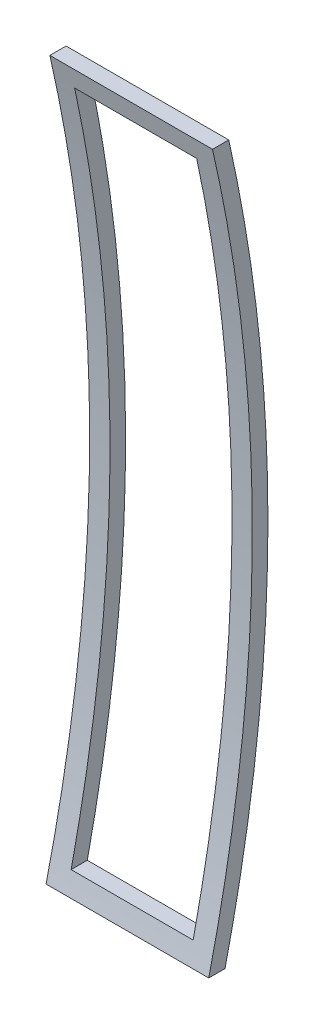
ISO-10303-21;
HEADER;
FILE_DESCRIPTION(('STEP AP214'),'2;1');
FILE_NAME('part.step','',(''),(''),'','','');
FILE_SCHEMA(('AUTOMOTIVE_DESIGN { 1 0 10303 214 1 1 1 1 }'));
ENDSEC;
DATA;
#1=APPLICATION_CONTEXT('core data for automotive mechanical design processes');
#2=APPLICATION_PROTOCOL_DEFINITION('international standard','automotive_design',2000,#1);
#3=PRODUCT_CONTEXT('',#1,'mechanical');
#4=PRODUCT('Part','Part','',(#3));
#5=PRODUCT_RELATED_PRODUCT_CATEGORY('part','',(#4));
#6=PRODUCT_DEFINITION_FORMATION('','',#4);
#7=PRODUCT_DEFINITION_CONTEXT('part definition',#1,'design');
#8=PRODUCT_DEFINITION('design','',#6,#7);
#9=PRODUCT_DEFINITION_SHAPE('','',#8);
#10=(LENGTH_UNIT() NAMED_UNIT(*) SI_UNIT(.MILLI.,.METRE.));
#11=(NAMED_UNIT(*) PLANE_ANGLE_UNIT() SI_UNIT($,.RADIAN.));
#12=(NAMED_UNIT(*) SI_UNIT($,.STERADIAN.) SOLID_ANGLE_UNIT());
#13=UNCERTAINTY_MEASURE_WITH_UNIT(LENGTH_MEASURE(1.E-05),#10,'distance_accuracy_value','');
#14=(GEOMETRIC_REPRESENTATION_CONTEXT(3) GLOBAL_UNCERTAINTY_ASSIGNED_CONTEXT((#13)) GLOBAL_UNIT_ASSIGNED_CONTEXT((#10,
#11,#12)) REPRESENTATION_CONTEXT('',''));
#15=CARTESIAN_POINT('',(0.,0.,0.));
#16=DIRECTION('',(0.,0.,1.));
#17=DIRECTION('',(1.,0.,0.));
#18=AXIS2_PLACEMENT_3D('',#15,#16,#17);
#19=CARTESIAN_POINT('',(0.,2235.2,317.5));
#20=DIRECTION('',(1.,0.,0.));
#21=DIRECTION('',(0.,0.,-1.));
#22=AXIS2_PLACEMENT_3D('',#19,#20,#21);
#23=PLANE('',#22);
#24=DIRECTION('',(0.,0.,-1.));
#25=VECTOR('',#24,1.);
#26=CARTESIAN_POINT('',(0.,2235.2,317.5));
#27=LINE('',#26,#25);
#28=CARTESIAN_POINT('',(0.,2235.2,-11.8215694462405));
#29=VERTEX_POINT('',#28);
#30=CARTESIAN_POINT('',(0.,2235.2,-62.441666666667));
#31=VERTEX_POINT('',#30);
#32=EDGE_CURVE('E197',#29,#31,#27,.T.);
#33=ORIENTED_EDGE('',*,*,#32,.T.);
#34=CARTESIAN_POINT('',(0.,0.,-50.8));
#35=CARTESIAN_POINT('',(0.,183.282593987935,-93.7568579659222));
#36=CARTESIAN_POINT('',(0.,367.938495880882,-126.706271475044));
#37=CARTESIAN_POINT('',(0.,647.078560023148,-160.417844849889));
#38=CARTESIAN_POINT('',(0.,740.484692022695,-169.035728699978));
#39=CARTESIAN_POINT('',(0.,857.702282187366,-176.456558680761));
#40=CARTESIAN_POINT('',(0.,892.902056055767,-178.431425593223));
#41=CARTESIAN_POINT('',(0.,928.153881246189,-180.026988846163));
#42=CARTESIAN_POINT('',(0.,951.666699325151,-181.006157850064));
#43=CARTESIAN_POINT('',(0.,963.426998718855,-181.453375980161));
#44=CARTESIAN_POINT('',(0.,1022.21278552335,-183.476257054454));
#45=CARTESIAN_POINT('',(0.,1069.22348635274,-184.413676029515));
#46=CARTESIAN_POINT('',(0.,1210.20192579219,-185.187938722063));
#47=CARTESIAN_POINT('',(0.,1304.11600150808,-182.986794075058));
#48=CARTESIAN_POINT('',(0.,1444.88027759742,-175.627644988089));
#49=CARTESIAN_POINT('',(0.,1503.50980144364,-171.716032673219));
#50=CARTESIAN_POINT('',(0.,1562.11156619715,-166.75019641377));
#51=CARTESIAN_POINT('',(0.,1585.5500526301,-164.679571807196));
#52=CARTESIAN_POINT('',(0.,1597.2699596783,-163.601939023314));
#53=CARTESIAN_POINT('',(0.,1632.4082367444,-160.244444379755));
#54=CARTESIAN_POINT('',(0.,1655.80742590005,-157.839846086817));
#55=CARTESIAN_POINT('',(0.,1866.16475736087,-134.712079657784));
#56=CARTESIAN_POINT('',(0.,2051.47593079517,-103.588202999001));
#57=CARTESIAN_POINT('',(0.,2235.2,-62.4416666666672));
#58=B_SPLINE_CURVE_WITH_KNOTS('',3,(#34,#35,#36,#37,#38,#39,#40,#41,#42,#43,#44,#45,#46,#47,#48,
#49,#50,#51,#52,#53,#54,#55,#56,#57),.UNSPECIFIED.,.F.,.F.,(4,2,2,1,2,2,2,2,1,2,2,2,4),(0.,
0.250000000000003,0.375000000000004,0.406250000000004,0.421875000000004,0.437500000000005,
0.500000000000004,0.625000000000004,0.687500000000003,0.703125000000003,0.718750000000003,
0.750000000000003,1.),.UNSPECIFIED.);
#59=CARTESIAN_POINT('',(0.,0.,-50.8));
#60=VERTEX_POINT('',#59);
#61=EDGE_CURVE('E171',#60,#31,#58,.T.);
#62=ORIENTED_EDGE('',*,*,#61,.F.);
#63=DIRECTION('',(0.,0.,-1.));
#64=VECTOR('',#63,1.);
#65=CARTESIAN_POINT('',(0.,0.,317.5));
#66=LINE('',#65,#64);
#67=CARTESIAN_POINT('',(0.,0.,0.));
#68=VERTEX_POINT('',#67);
#69=EDGE_CURVE('E135',#68,#60,#66,.T.);
#70=ORIENTED_EDGE('',*,*,#69,.F.);
#71=CARTESIAN_POINT('',(0.,2235.2,-11.8215694462405));
#72=CARTESIAN_POINT('',(0.,2051.59277239303,-53.5781393399253));
#73=CARTESIAN_POINT('',(0.,1866.20744785701,-85.222640891282));
#74=CARTESIAN_POINT('',(0.,1667.22908738496,-107.434189609261));
#75=CARTESIAN_POINT('',(0.,1655.51604136105,-108.698878545484));
#76=CARTESIAN_POINT('',(0.,1632.08991180398,-111.142504459225));
#77=CARTESIAN_POINT('',(0.,1596.94560999248,-114.679903906652));
#78=CARTESIAN_POINT('',(0.,1514.90645434215,-122.036747111341));
#79=CARTESIAN_POINT('',(0.,1444.52572169496,-126.80196151495));
#80=CARTESIAN_POINT('',(0.,1303.68201965033,-134.270795459749));
#81=CARTESIAN_POINT('',(0.,1209.6765687295,-136.501210965293));
#82=CARTESIAN_POINT('',(0.,1092.03171799234,-135.828775663223));
#83=CARTESIAN_POINT('',(0.,1056.72791005443,-135.367512593157));
#84=CARTESIAN_POINT('',(0.,1021.40854581314,-134.516268218593));
#85=CARTESIAN_POINT('',(0.,997.85884301233,-133.862033824226));
#86=CARTESIAN_POINT('',(0.,986.086879755596,-133.491664453907));
#87=CARTESIAN_POINT('',(0.,927.264731080624,-131.424864721211));
#88=CARTESIAN_POINT('',(0.,880.304237017489,-129.082951268287));
#89=CARTESIAN_POINT('',(0.,739.710830806113,-120.017272867546));
#90=CARTESIAN_POINT('',(0.,646.365974305708,-111.253713840902));
#91=CARTESIAN_POINT('',(0.,367.455601671346,-77.0023176094959));
#92=CARTESIAN_POINT('',(0.,183.01397054269,-43.5559696228651));
#93=CARTESIAN_POINT('',(0.,0.,0.));
#94=B_SPLINE_CURVE_WITH_KNOTS('',3,(#71,#72,#73,#74,#75,#76,#77,#78,#79,#80,#81,#82,#83,#84,#85,
#86,#87,#88,#89,#90,#91,#92,#93),.UNSPECIFIED.,.F.,.F.,(4,2,2,1,1,2,2,1,2,2,2,2,4),(0.,0.25,
0.265625,0.28125,0.3125,0.375,0.5,0.53125,0.546875,0.5625,0.625,0.75,1.),.UNSPECIFIED.);
#95=EDGE_CURVE('E183',#29,#68,#94,.T.);
#96=ORIENTED_EDGE('',*,*,#95,.F.);
#97=EDGE_LOOP('',(#33,#62,#70,#96));
#98=FACE_BOUND('',#97,.T.);
#99=ADVANCED_FACE('F66',(#98),#23,.F.);
#100=CARTESIAN_POINT('',(0.,0.,317.5));
#101=DIRECTION('',(0.,1.,0.));
#102=DIRECTION('',(0.,0.,1.));
#103=AXIS2_PLACEMENT_3D('',#100,#101,#102);
#104=PLANE('',#103);
#105=ORIENTED_EDGE('',*,*,#69,.T.);
#106=DIRECTION('',(-1.,0.,0.));
#107=VECTOR('',#106,1.);
#108=CARTESIAN_POINT('',(508.,0.,-50.8));
#109=LINE('',#108,#107);
#110=CARTESIAN_POINT('',(508.,0.,-50.8));
#111=VERTEX_POINT('',#110);
#112=EDGE_CURVE('E264',#111,#60,#109,.T.);
#113=ORIENTED_EDGE('',*,*,#112,.F.);
#114=DIRECTION('',(0.,0.,-1.));
#115=VECTOR('',#114,1.);
#116=CARTESIAN_POINT('',(508.,0.,317.5));
#117=LINE('',#116,#115);
#118=CARTESIAN_POINT('',(508.,0.,0.));
#119=VERTEX_POINT('',#118);
#120=EDGE_CURVE('E187',#119,#111,#117,.T.);
#121=ORIENTED_EDGE('',*,*,#120,.F.);
#122=DIRECTION('',(-1.,0.,0.));
#123=VECTOR('',#122,1.);
#124=CARTESIAN_POINT('',(508.,0.,0.));
#125=LINE('',#124,#123);
#126=EDGE_CURVE('E253',#119,#68,#125,.T.);
#127=ORIENTED_EDGE('',*,*,#126,.T.);
#128=EDGE_LOOP('',(#105,#113,#121,#127));
#129=FACE_BOUND('',#128,.T.);
#130=ADVANCED_FACE('F283',(#129),#104,.F.);
#131=CARTESIAN_POINT('',(508.,2235.2,317.5));
#132=DIRECTION('',(-1.,0.,0.));
#133=DIRECTION('',(0.,0.,1.));
#134=AXIS2_PLACEMENT_3D('',#131,#132,#133);
#135=PLANE('',#134);
#136=ORIENTED_EDGE('',*,*,#120,.T.);
#137=CARTESIAN_POINT('',(508.,2235.2,-62.4416666666672));
#138=CARTESIAN_POINT('',(508.,2051.47593079517,-103.588202999001));
#139=CARTESIAN_POINT('',(508.,1866.16475736087,-134.712079657784));
#140=CARTESIAN_POINT('',(508.,1655.80742590005,-157.839846086817));
#141=CARTESIAN_POINT('',(508.,1632.4082367444,-160.244444379755));
#142=CARTESIAN_POINT('',(508.,1597.2699596783,-163.601939023314));
#143=CARTESIAN_POINT('',(508.,1585.5500526301,-164.679571807196));
#144=CARTESIAN_POINT('',(508.,1562.11156619715,-166.75019641377));
#145=CARTESIAN_POINT('',(508.,1503.50980144364,-171.716032673219));
#146=CARTESIAN_POINT('',(508.,1444.88027759742,-175.627644988089));
#147=CARTESIAN_POINT('',(508.,1304.11600150808,-182.986794075058));
#148=CARTESIAN_POINT('',(508.,1210.20192579219,-185.187938722063));
#149=CARTESIAN_POINT('',(508.,1069.22348635274,-184.413676029515));
#150=CARTESIAN_POINT('',(508.,1022.21278552335,-183.476257054454));
#151=CARTESIAN_POINT('',(508.,963.426998718855,-181.453375980161));
#152=CARTESIAN_POINT('',(508.,951.666699325151,-181.006157850064));
#153=CARTESIAN_POINT('',(508.,928.153881246189,-180.026988846163));
#154=CARTESIAN_POINT('',(508.,892.902056055767,-178.431425593223));
#155=CARTESIAN_POINT('',(508.,857.702282187366,-176.456558680761));
#156=CARTESIAN_POINT('',(508.,740.484692022695,-169.035728699978));
#157=CARTESIAN_POINT('',(508.,647.078560023148,-160.417844849889));
#158=CARTESIAN_POINT('',(508.,367.938495880882,-126.706271475044));
#159=CARTESIAN_POINT('',(508.,183.282593987935,-93.7568579659222));
#160=CARTESIAN_POINT('',(508.,0.,-50.8));
#161=B_SPLINE_CURVE_WITH_KNOTS('',3,(#137,#138,#139,#140,#141,#142,#143,#144,#145,#146,#147,
#148,#149,#150,#151,#152,#153,#154,#155,#156,#157,#158,#159,#160),.UNSPECIFIED.,.F.,.F.,(4,2,2,
2,1,2,2,2,2,1,2,2,4),(0.,0.249999999999997,0.281249999999997,0.296874999999997,
0.312499999999997,0.374999999999996,0.499999999999996,0.562499999999995,0.578124999999996,
0.593749999999996,0.624999999999996,0.749999999999997,1.),.UNSPECIFIED.);
#162=CARTESIAN_POINT('',(508.,2235.2,-62.4416666666672));
#163=VERTEX_POINT('',#162);
#164=EDGE_CURVE('E269',#111,#163,#161,.F.);
#165=ORIENTED_EDGE('',*,*,#164,.T.);
#166=DIRECTION('',(0.,0.,-1.));
#167=VECTOR('',#166,1.);
#168=CARTESIAN_POINT('',(508.,2235.2,317.5));
#169=LINE('',#168,#167);
#170=CARTESIAN_POINT('',(508.,2235.2,-11.8215694462402));
#171=VERTEX_POINT('',#170);
#172=EDGE_CURVE('E200',#171,#163,#169,.T.);
#173=ORIENTED_EDGE('',*,*,#172,.F.);
#174=CARTESIAN_POINT('',(508.,0.,0.));
#175=CARTESIAN_POINT('',(508.,183.01397054269,-43.5559696228651));
#176=CARTESIAN_POINT('',(508.,367.455601671346,-77.0023176094959));
#177=CARTESIAN_POINT('',(508.,646.365974305708,-111.253713840902));
#178=CARTESIAN_POINT('',(508.,739.710830806113,-120.017272867546));
#179=CARTESIAN_POINT('',(508.,880.304237017489,-129.082951268287));
#180=CARTESIAN_POINT('',(508.,927.264731080624,-131.424864721211));
#181=CARTESIAN_POINT('',(508.,986.086879755596,-133.491664453907));
#182=CARTESIAN_POINT('',(508.,997.85884301233,-133.862033824226));
#183=CARTESIAN_POINT('',(508.,1021.40854581314,-134.516268218593));
#184=CARTESIAN_POINT('',(508.,1056.72791005443,-135.367512593157));
#185=CARTESIAN_POINT('',(508.,1092.03171799234,-135.828775663223));
#186=CARTESIAN_POINT('',(508.,1209.6765687295,-136.501210965293));
#187=CARTESIAN_POINT('',(508.,1303.68201965033,-134.270795459749));
#188=CARTESIAN_POINT('',(508.,1444.52572169496,-126.80196151495));
#189=CARTESIAN_POINT('',(508.,1514.90645434215,-122.036747111341));
#190=CARTESIAN_POINT('',(508.,1596.94560999248,-114.679903906652));
#191=CARTESIAN_POINT('',(508.,1632.08991180398,-111.142504459225));
#192=CARTESIAN_POINT('',(508.,1655.51604136105,-108.698878545484));
#193=CARTESIAN_POINT('',(508.,1667.22908738496,-107.434189609261));
#194=CARTESIAN_POINT('',(508.,1866.20744785701,-85.222640891282));
#195=CARTESIAN_POINT('',(508.,2051.59277239303,-53.5781393399253));
#196=CARTESIAN_POINT('',(508.,2235.2,-11.8215694462405));
#197=B_SPLINE_CURVE_WITH_KNOTS('',3,(#174,#175,#176,#177,#178,#179,#180,#181,#182,#183,#184,
#185,#186,#187,#188,#189,#190,#191,#192,#193,#194,#195,#196),.UNSPECIFIED.,.F.,.F.,(4,2,2,2,2,1,
2,2,1,1,2,2,4),(0.,0.25,0.375,0.4375,0.453125,0.46875,0.5,0.625,0.6875,0.71875,0.734375,0.75,
1.),.UNSPECIFIED.);
#198=EDGE_CURVE('E242',#171,#119,#197,.F.);
#199=ORIENTED_EDGE('',*,*,#198,.T.);
#200=EDGE_LOOP('',(#136,#165,#173,#199));
#201=FACE_BOUND('',#200,.T.);
#202=ADVANCED_FACE('F287',(#201),#135,.F.);
#203=CARTESIAN_POINT('',(0.,2235.2,317.5));
#204=DIRECTION('',(0.,-1.,0.));
#205=DIRECTION('',(0.,0.,-1.));
#206=AXIS2_PLACEMENT_3D('',#203,#204,#205);
#207=PLANE('',#206);
#208=ORIENTED_EDGE('',*,*,#172,.T.);
#209=DIRECTION('',(-1.,0.,0.));
#210=VECTOR('',#209,1.);
#211=CARTESIAN_POINT('',(508.,2235.2,-62.4416666666672));
#212=LINE('',#211,#210);
#213=EDGE_CURVE('E265',#163,#31,#212,.T.);
#214=ORIENTED_EDGE('',*,*,#213,.T.);
#215=ORIENTED_EDGE('',*,*,#32,.F.);
#216=DIRECTION('',(-1.,0.,0.));
#217=VECTOR('',#216,1.);
#218=CARTESIAN_POINT('',(508.,2235.2,-11.8215694462405));
#219=LINE('',#218,#217);
#220=EDGE_CURVE('E201',#171,#29,#219,.T.);
#221=ORIENTED_EDGE('',*,*,#220,.F.);
#222=EDGE_LOOP('',(#208,#214,#215,#221));
#223=FACE_BOUND('',#222,.T.);
#224=ADVANCED_FACE('F222',(#223),#207,.F.);
#225=CARTESIAN_POINT('',(508.,2235.2,-11.8215694462405));
#226=CARTESIAN_POINT('',(508.,2051.59277239303,-53.5781393399253));
#227=CARTESIAN_POINT('',(508.,1866.20744785701,-85.222640891282));
#228=CARTESIAN_POINT('',(508.,1667.22908738496,-107.434189609261));
#229=CARTESIAN_POINT('',(508.,1655.51604136105,-108.698878545484));
#230=CARTESIAN_POINT('',(508.,1632.08991180398,-111.142504459225));
#231=CARTESIAN_POINT('',(508.,1596.94560999248,-114.679903906652));
#232=CARTESIAN_POINT('',(508.,1514.90645434215,-122.036747111341));
#233=CARTESIAN_POINT('',(508.,1444.52572169496,-126.80196151495));
#234=CARTESIAN_POINT('',(508.,1303.68201965033,-134.270795459749));
#235=CARTESIAN_POINT('',(508.,1209.6765687295,-136.501210965293));
#236=CARTESIAN_POINT('',(508.,1092.03171799234,-135.828775663223));
#237=CARTESIAN_POINT('',(508.,1056.72791005443,-135.367512593157));
#238=CARTESIAN_POINT('',(508.,1021.40854581314,-134.516268218593));
#239=CARTESIAN_POINT('',(508.,997.85884301233,-133.862033824226));
#240=CARTESIAN_POINT('',(508.,986.086879755596,-133.491664453907));
#241=CARTESIAN_POINT('',(508.,927.264731080624,-131.424864721211));
#242=CARTESIAN_POINT('',(508.,880.304237017489,-129.082951268287));
#243=CARTESIAN_POINT('',(508.,739.710830806113,-120.017272867546));
#244=CARTESIAN_POINT('',(508.,646.365974305708,-111.253713840902));
#245=CARTESIAN_POINT('',(508.,367.455601671346,-77.0023176094959));
#246=CARTESIAN_POINT('',(508.,183.01397054269,-43.5559696228651));
#247=CARTESIAN_POINT('',(508.,0.,0.));
#248=B_SPLINE_CURVE_WITH_KNOTS('',3,(#225,#226,#227,#228,#229,#230,#231,#232,#233,#234,#235,
#236,#237,#238,#239,#240,#241,#242,#243,#244,#245,#246,#247),.UNSPECIFIED.,.F.,.F.,(4,2,2,1,1,2,
2,1,2,2,2,2,4),(0.,0.25,0.265625,0.28125,0.3125,0.375,0.5,0.53125,0.546875,0.5625,0.625,0.75,
1.),.UNSPECIFIED.);
#249=DIRECTION('',(-1.,0.,0.));
#250=VECTOR('',#249,1.);
#251=SURFACE_OF_LINEAR_EXTRUSION('',#248,#250);
#252=DIRECTION('',(-1.,0.,0.));
#253=VECTOR('',#252,1.);
#254=CARTESIAN_POINT('',(508.,63.5000000000002,-14.6931616843525));
#255=LINE('',#254,#253);
#256=CARTESIAN_POINT('',(444.5,63.5,-14.6931616843528));
#257=VERTEX_POINT('',#256);
#258=CARTESIAN_POINT('',(63.5,63.5000000000002,-14.6931616843525));
#259=VERTEX_POINT('',#258);
#260=EDGE_CURVE('E322',#257,#259,#255,.T.);
#261=ORIENTED_EDGE('',*,*,#260,.T.);
#262=CARTESIAN_POINT('',(63.5,2235.2,-11.8215694462405));
#263=CARTESIAN_POINT('',(63.5,2051.59277239303,-53.5781393399253));
#264=CARTESIAN_POINT('',(63.5,1866.20744785701,-85.222640891282));
#265=CARTESIAN_POINT('',(63.5,1667.22908738496,-107.434189609261));
#266=CARTESIAN_POINT('',(63.5,1655.51604136105,-108.698878545484));
#267=CARTESIAN_POINT('',(63.5,1632.08991180398,-111.142504459225));
#268=CARTESIAN_POINT('',(63.5,1596.94560999248,-114.679903906652));
#269=CARTESIAN_POINT('',(63.5,1514.90645434215,-122.036747111341));
#270=CARTESIAN_POINT('',(63.5,1444.52572169496,-126.80196151495));
#271=CARTESIAN_POINT('',(63.5,1303.68201965033,-134.270795459749));
#272=CARTESIAN_POINT('',(63.5,1209.6765687295,-136.501210965293));
#273=CARTESIAN_POINT('',(63.5,1092.03171799234,-135.828775663223));
#274=CARTESIAN_POINT('',(63.5,1056.72791005443,-135.367512593157));
#275=CARTESIAN_POINT('',(63.5,1021.40854581314,-134.516268218593));
#276=CARTESIAN_POINT('',(63.5,997.85884301233,-133.862033824226));
#277=CARTESIAN_POINT('',(63.5,986.086879755596,-133.491664453907));
#278=CARTESIAN_POINT('',(63.5,927.264731080624,-131.424864721211));
#279=CARTESIAN_POINT('',(63.5,880.304237017489,-129.082951268287));
#280=CARTESIAN_POINT('',(63.5,739.710830806113,-120.017272867546));
#281=CARTESIAN_POINT('',(63.5,646.365974305708,-111.253713840902));
#282=CARTESIAN_POINT('',(63.5,367.455601671346,-77.0023176094959));
#283=CARTESIAN_POINT('',(63.5,183.01397054269,-43.5559696228651));
#284=CARTESIAN_POINT('',(63.5,0.,0.));
#285=B_SPLINE_CURVE_WITH_KNOTS('',3,(#262,#263,#264,#265,#266,#267,#268,#269,#270,#271,#272,
#273,#274,#275,#276,#277,#278,#279,#280,#281,#282,#283,#284),.UNSPECIFIED.,.F.,.F.,(4,2,2,1,1,2,
2,1,2,2,2,2,4),(0.,0.25,0.265625,0.28125,0.3125,0.375,0.5,0.53125,0.546875,0.5625,0.625,0.75,
1.),.UNSPECIFIED.);
#286=CARTESIAN_POINT('',(63.5,2171.7,-25.8436000514238));
#287=VERTEX_POINT('',#286);
#288=EDGE_CURVE('E142',#259,#287,#285,.F.);
#289=ORIENTED_EDGE('',*,*,#288,.T.);
#290=DIRECTION('',(-1.,0.,0.));
#291=VECTOR('',#290,1.);
#292=CARTESIAN_POINT('',(508.,2171.7,-25.8436000514236));
#293=LINE('',#292,#291);
#294=CARTESIAN_POINT('',(444.5,2171.7,-25.8436000504523));
#295=VERTEX_POINT('',#294);
#296=EDGE_CURVE('E311',#287,#295,#293,.F.);
#297=ORIENTED_EDGE('',*,*,#296,.T.);
#298=CARTESIAN_POINT('',(444.5,2235.2,-11.8215694462405));
#299=CARTESIAN_POINT('',(444.5,2051.59277239303,-53.5781393399253));
#300=CARTESIAN_POINT('',(444.5,1866.20744785701,-85.222640891282));
#301=CARTESIAN_POINT('',(444.5,1667.22908738496,-107.434189609261));
#302=CARTESIAN_POINT('',(444.5,1655.51604136105,-108.698878545484));
#303=CARTESIAN_POINT('',(444.5,1632.08991180398,-111.142504459225));
#304=CARTESIAN_POINT('',(444.5,1596.94560999248,-114.679903906652));
#305=CARTESIAN_POINT('',(444.5,1514.90645434215,-122.036747111341));
#306=CARTESIAN_POINT('',(444.5,1444.52572169496,-126.80196151495));
#307=CARTESIAN_POINT('',(444.5,1303.68201965033,-134.270795459749));
#308=CARTESIAN_POINT('',(444.5,1209.6765687295,-136.501210965293));
#309=CARTESIAN_POINT('',(444.5,1092.03171799234,-135.828775663223));
#310=CARTESIAN_POINT('',(444.5,1056.72791005443,-135.367512593157));
#311=CARTESIAN_POINT('',(444.5,1021.40854581314,-134.516268218593));
#312=CARTESIAN_POINT('',(444.5,997.85884301233,-133.862033824226));
#313=CARTESIAN_POINT('',(444.5,986.086879755596,-133.491664453907));
#314=CARTESIAN_POINT('',(444.5,927.264731080624,-131.424864721211));
#315=CARTESIAN_POINT('',(444.5,880.304237017489,-129.082951268287));
#316=CARTESIAN_POINT('',(444.5,739.710830806113,-120.017272867546));
#317=CARTESIAN_POINT('',(444.5,646.365974305708,-111.253713840902));
#318=CARTESIAN_POINT('',(444.5,367.455601671346,-77.0023176094959));
#319=CARTESIAN_POINT('',(444.5,183.01397054269,-43.5559696228651));
#320=CARTESIAN_POINT('',(444.5,0.,0.));
#321=B_SPLINE_CURVE_WITH_KNOTS('',3,(#298,#299,#300,#301,#302,#303,#304,#305,#306,#307,#308,
#309,#310,#311,#312,#313,#314,#315,#316,#317,#318,#319,#320),.UNSPECIFIED.,.F.,.F.,(4,2,2,1,1,2,
2,1,2,2,2,2,4),(0.,0.25,0.265625,0.28125,0.3125,0.375,0.5,0.53125,0.546875,0.5625,0.625,0.75,
1.),.UNSPECIFIED.);
#322=EDGE_CURVE('E317',#295,#257,#321,.T.);
#323=ORIENTED_EDGE('',*,*,#322,.T.);
#324=EDGE_LOOP('',(#261,#289,#297,#323));
#325=FACE_BOUND('',#324,.T.);
#326=ORIENTED_EDGE('',*,*,#95,.T.);
#327=ORIENTED_EDGE('',*,*,#126,.F.);
#328=ORIENTED_EDGE('',*,*,#198,.F.);
#329=ORIENTED_EDGE('',*,*,#220,.T.);
#330=EDGE_LOOP('',(#326,#327,#328,#329));
#331=FACE_BOUND('',#330,.T.);
#332=ADVANCED_FACE('F211',(#325,#331),#251,.F.);
#333=CARTESIAN_POINT('',(508.,0.,-50.8));
#334=CARTESIAN_POINT('',(508.,183.282593987935,-93.7568579659222));
#335=CARTESIAN_POINT('',(508.,367.938495880882,-126.706271475044));
#336=CARTESIAN_POINT('',(508.,647.078560023148,-160.417844849889));
#337=CARTESIAN_POINT('',(508.,740.484692022695,-169.035728699978));
#338=CARTESIAN_POINT('',(508.,857.702282187366,-176.456558680761));
#339=CARTESIAN_POINT('',(508.,892.902056055767,-178.431425593223));
#340=CARTESIAN_POINT('',(508.,928.153881246189,-180.026988846163));
#341=CARTESIAN_POINT('',(508.,951.666699325151,-181.006157850064));
#342=CARTESIAN_POINT('',(508.,963.426998718855,-181.453375980161));
#343=CARTESIAN_POINT('',(508.,1022.21278552335,-183.476257054454));
#344=CARTESIAN_POINT('',(508.,1069.22348635274,-184.413676029515));
#345=CARTESIAN_POINT('',(508.,1210.20192579219,-185.187938722063));
#346=CARTESIAN_POINT('',(508.,1304.11600150808,-182.986794075058));
#347=CARTESIAN_POINT('',(508.,1444.88027759742,-175.627644988089));
#348=CARTESIAN_POINT('',(508.,1503.50980144364,-171.716032673219));
#349=CARTESIAN_POINT('',(508.,1562.11156619715,-166.75019641377));
#350=CARTESIAN_POINT('',(508.,1585.5500526301,-164.679571807196));
#351=CARTESIAN_POINT('',(508.,1597.2699596783,-163.601939023314));
#352=CARTESIAN_POINT('',(508.,1632.4082367444,-160.244444379755));
#353=CARTESIAN_POINT('',(508.,1655.80742590005,-157.839846086817));
#354=CARTESIAN_POINT('',(508.,1866.16475736087,-134.712079657784));
#355=CARTESIAN_POINT('',(508.,2051.47593079517,-103.588202999001));
#356=CARTESIAN_POINT('',(508.,2235.2,-62.4416666666672));
#357=B_SPLINE_CURVE_WITH_KNOTS('',3,(#333,#334,#335,#336,#337,#338,#339,#340,#341,#342,#343,
#344,#345,#346,#347,#348,#349,#350,#351,#352,#353,#354,#355,#356),.UNSPECIFIED.,.F.,.F.,(4,2,2,
1,2,2,2,2,1,2,2,2,4),(0.,0.250000000000003,0.375000000000004,0.406250000000004,
0.421875000000004,0.437500000000005,0.500000000000004,0.625000000000004,0.687500000000003,
0.703125000000003,0.718750000000003,0.750000000000003,1.),.UNSPECIFIED.);
#358=DIRECTION('',(-1.,0.,0.));
#359=VECTOR('',#358,1.);
#360=SURFACE_OF_LINEAR_EXTRUSION('',#357,#359);
#361=DIRECTION('',(-1.,0.,0.));
#362=VECTOR('',#361,1.);
#363=CARTESIAN_POINT('',(508.,2171.7,-76.2497361939124));
#364=LINE('',#363,#362);
#365=CARTESIAN_POINT('',(444.5,2171.7,-76.2497361922915));
#366=VERTEX_POINT('',#365);
#367=CARTESIAN_POINT('',(63.5,2171.7,-76.2497361939126));
#368=VERTEX_POINT('',#367);
#369=EDGE_CURVE('E76',#366,#368,#364,.T.);
#370=ORIENTED_EDGE('',*,*,#369,.T.);
#371=CARTESIAN_POINT('',(63.5,0.,-50.8));
#372=CARTESIAN_POINT('',(63.5,183.282593987935,-93.7568579659222));
#373=CARTESIAN_POINT('',(63.5,367.938495880882,-126.706271475044));
#374=CARTESIAN_POINT('',(63.5,647.078560023148,-160.417844849889));
#375=CARTESIAN_POINT('',(63.5,740.484692022695,-169.035728699978));
#376=CARTESIAN_POINT('',(63.5,857.702282187366,-176.456558680761));
#377=CARTESIAN_POINT('',(63.5,892.902056055767,-178.431425593223));
#378=CARTESIAN_POINT('',(63.5,928.153881246189,-180.026988846163));
#379=CARTESIAN_POINT('',(63.5,951.666699325151,-181.006157850064));
#380=CARTESIAN_POINT('',(63.5,963.426998718855,-181.453375980161));
#381=CARTESIAN_POINT('',(63.5,1022.21278552335,-183.476257054454));
#382=CARTESIAN_POINT('',(63.5,1069.22348635274,-184.413676029515));
#383=CARTESIAN_POINT('',(63.5,1210.20192579219,-185.187938722063));
#384=CARTESIAN_POINT('',(63.5,1304.11600150808,-182.986794075058));
#385=CARTESIAN_POINT('',(63.5,1444.88027759742,-175.627644988089));
#386=CARTESIAN_POINT('',(63.5,1503.50980144364,-171.716032673219));
#387=CARTESIAN_POINT('',(63.5,1562.11156619715,-166.75019641377));
#388=CARTESIAN_POINT('',(63.5,1585.5500526301,-164.679571807196));
#389=CARTESIAN_POINT('',(63.5,1597.2699596783,-163.601939023314));
#390=CARTESIAN_POINT('',(63.5,1632.4082367444,-160.244444379755));
#391=CARTESIAN_POINT('',(63.5,1655.80742590005,-157.839846086817));
#392=CARTESIAN_POINT('',(63.5,1866.16475736087,-134.712079657784));
#393=CARTESIAN_POINT('',(63.5,2051.47593079517,-103.588202999001));
#394=CARTESIAN_POINT('',(63.5,2235.2,-62.4416666666672));
#395=B_SPLINE_CURVE_WITH_KNOTS('',3,(#371,#372,#373,#374,#375,#376,#377,#378,#379,#380,#381,
#382,#383,#384,#385,#386,#387,#388,#389,#390,#391,#392,#393,#394),.UNSPECIFIED.,.F.,.F.,(4,2,2,
1,2,2,2,2,1,2,2,2,4),(0.,0.250000000000003,0.375000000000004,0.406250000000004,
0.421875000000004,0.437500000000005,0.500000000000004,0.625000000000004,0.687500000000003,
0.703125000000003,0.718750000000003,0.750000000000003,1.),.UNSPECIFIED.);
#396=CARTESIAN_POINT('',(63.5,63.5,-65.2694957578716));
#397=VERTEX_POINT('',#396);
#398=EDGE_CURVE('E12',#368,#397,#395,.F.);
#399=ORIENTED_EDGE('',*,*,#398,.T.);
#400=DIRECTION('',(-1.,0.,0.));
#401=VECTOR('',#400,1.);
#402=CARTESIAN_POINT('',(508.,63.5,-65.2694957578713));
#403=LINE('',#402,#401);
#404=CARTESIAN_POINT('',(444.5,63.5,-65.2694957578713));
#405=VERTEX_POINT('',#404);
#406=EDGE_CURVE('E130',#397,#405,#403,.F.);
#407=ORIENTED_EDGE('',*,*,#406,.T.);
#408=CARTESIAN_POINT('',(444.5,0.,-50.8));
#409=CARTESIAN_POINT('',(444.5,183.282593987935,-93.7568579659222));
#410=CARTESIAN_POINT('',(444.5,367.938495880882,-126.706271475044));
#411=CARTESIAN_POINT('',(444.5,647.078560023148,-160.417844849889));
#412=CARTESIAN_POINT('',(444.5,740.484692022695,-169.035728699978));
#413=CARTESIAN_POINT('',(444.5,857.702282187366,-176.456558680761));
#414=CARTESIAN_POINT('',(444.5,892.902056055767,-178.431425593223));
#415=CARTESIAN_POINT('',(444.5,928.153881246189,-180.026988846163));
#416=CARTESIAN_POINT('',(444.5,951.666699325151,-181.006157850064));
#417=CARTESIAN_POINT('',(444.5,963.426998718855,-181.453375980161));
#418=CARTESIAN_POINT('',(444.5,1022.21278552335,-183.476257054454));
#419=CARTESIAN_POINT('',(444.5,1069.22348635274,-184.413676029515));
#420=CARTESIAN_POINT('',(444.5,1210.20192579219,-185.187938722063));
#421=CARTESIAN_POINT('',(444.5,1304.11600150808,-182.986794075058));
#422=CARTESIAN_POINT('',(444.5,1444.88027759742,-175.627644988089));
#423=CARTESIAN_POINT('',(444.5,1503.50980144364,-171.716032673219));
#424=CARTESIAN_POINT('',(444.5,1562.11156619715,-166.75019641377));
#425=CARTESIAN_POINT('',(444.5,1585.5500526301,-164.679571807196));
#426=CARTESIAN_POINT('',(444.5,1597.2699596783,-163.601939023314));
#427=CARTESIAN_POINT('',(444.5,1632.4082367444,-160.244444379755));
#428=CARTESIAN_POINT('',(444.5,1655.80742590005,-157.839846086817));
#429=CARTESIAN_POINT('',(444.5,1866.16475736087,-134.712079657784));
#430=CARTESIAN_POINT('',(444.5,2051.47593079517,-103.588202999001));
#431=CARTESIAN_POINT('',(444.5,2235.2,-62.4416666666672));
#432=B_SPLINE_CURVE_WITH_KNOTS('',3,(#408,#409,#410,#411,#412,#413,#414,#415,#416,#417,#418,
#419,#420,#421,#422,#423,#424,#425,#426,#427,#428,#429,#430,#431),.UNSPECIFIED.,.F.,.F.,(4,2,2,
1,2,2,2,2,1,2,2,2,4),(0.,0.250000000000003,0.375000000000004,0.406250000000004,
0.421875000000004,0.437500000000005,0.500000000000004,0.625000000000004,0.687500000000003,
0.703125000000003,0.718750000000003,0.750000000000003,1.),.UNSPECIFIED.);
#433=EDGE_CURVE('E134',#405,#366,#432,.T.);
#434=ORIENTED_EDGE('',*,*,#433,.T.);
#435=EDGE_LOOP('',(#370,#399,#407,#434));
#436=FACE_BOUND('',#435,.T.);
#437=ORIENTED_EDGE('',*,*,#61,.T.);
#438=ORIENTED_EDGE('',*,*,#213,.F.);
#439=ORIENTED_EDGE('',*,*,#164,.F.);
#440=ORIENTED_EDGE('',*,*,#112,.T.);
#441=EDGE_LOOP('',(#437,#438,#439,#440));
#442=FACE_BOUND('',#441,.T.);
#443=ADVANCED_FACE('F146',(#436,#442),#360,.F.);
#444=CARTESIAN_POINT('',(63.5,2171.7,-635.));
#445=DIRECTION('',(-1.,0.,0.));
#446=DIRECTION('',(0.,0.,1.));
#447=AXIS2_PLACEMENT_3D('',#444,#445,#446);
#448=PLANE('',#447);
#449=DIRECTION('',(0.,0.,1.));
#450=VECTOR('',#449,1.);
#451=CARTESIAN_POINT('',(63.5,63.5,-635.));
#452=LINE('',#451,#450);
#453=EDGE_CURVE('E83',#397,#259,#452,.T.);
#454=ORIENTED_EDGE('',*,*,#453,.F.);
#455=ORIENTED_EDGE('',*,*,#398,.F.);
#456=DIRECTION('',(0.,0.,1.));
#457=VECTOR('',#456,1.);
#458=CARTESIAN_POINT('',(63.5,2171.7,-635.));
#459=LINE('',#458,#457);
#460=EDGE_CURVE('E326',#368,#287,#459,.T.);
#461=ORIENTED_EDGE('',*,*,#460,.T.);
#462=ORIENTED_EDGE('',*,*,#288,.F.);
#463=EDGE_LOOP('',(#454,#455,#461,#462));
#464=FACE_BOUND('',#463,.T.);
#465=ADVANCED_FACE('F138',(#464),#448,.F.);
#466=CARTESIAN_POINT('',(444.5,2171.7,-635.));
#467=DIRECTION('',(0.,1.,0.));
#468=DIRECTION('',(-1.,0.,0.));
#469=AXIS2_PLACEMENT_3D('',#466,#467,#468);
#470=PLANE('',#469);
#471=ORIENTED_EDGE('',*,*,#460,.F.);
#472=ORIENTED_EDGE('',*,*,#369,.F.);
#473=DIRECTION('',(0.,0.,1.));
#474=VECTOR('',#473,1.);
#475=CARTESIAN_POINT('',(444.5,2171.7,-635.));
#476=LINE('',#475,#474);
#477=EDGE_CURVE('E329',#366,#295,#476,.T.);
#478=ORIENTED_EDGE('',*,*,#477,.T.);
#479=ORIENTED_EDGE('',*,*,#296,.F.);
#480=EDGE_LOOP('',(#471,#472,#478,#479));
#481=FACE_BOUND('',#480,.T.);
#482=ADVANCED_FACE('F333',(#481),#470,.F.);
#483=CARTESIAN_POINT('',(444.5,63.5,-635.));
#484=DIRECTION('',(1.,0.,0.));
#485=DIRECTION('',(0.,0.,-1.));
#486=AXIS2_PLACEMENT_3D('',#483,#484,#485);
#487=PLANE('',#486);
#488=ORIENTED_EDGE('',*,*,#477,.F.);
#489=ORIENTED_EDGE('',*,*,#433,.F.);
#490=DIRECTION('',(0.,0.,1.));
#491=VECTOR('',#490,1.);
#492=CARTESIAN_POINT('',(444.5,63.5,-635.));
#493=LINE('',#492,#491);
#494=EDGE_CURVE('E88',#405,#257,#493,.T.);
#495=ORIENTED_EDGE('',*,*,#494,.T.);
#496=ORIENTED_EDGE('',*,*,#322,.F.);
#497=EDGE_LOOP('',(#488,#489,#495,#496));
#498=FACE_BOUND('',#497,.T.);
#499=ADVANCED_FACE('F332',(#498),#487,.F.);
#500=CARTESIAN_POINT('',(63.5,63.5,-635.));
#501=DIRECTION('',(0.,-1.,0.));
#502=DIRECTION('',(0.,0.,-1.));
#503=AXIS2_PLACEMENT_3D('',#500,#501,#502);
#504=PLANE('',#503);
#505=ORIENTED_EDGE('',*,*,#494,.F.);
#506=ORIENTED_EDGE('',*,*,#406,.F.);
#507=ORIENTED_EDGE('',*,*,#453,.T.);
#508=ORIENTED_EDGE('',*,*,#260,.F.);
#509=EDGE_LOOP('',(#505,#506,#507,#508));
#510=FACE_BOUND('',#509,.T.);
#511=ADVANCED_FACE('F131',(#510),#504,.F.);
#512=CLOSED_SHELL('',(#99,#130,#202,#224,#332,#443,#465,#482,#499,#511));
#513=MANIFOLD_SOLID_BREP('B2',#512);
#514=ADVANCED_BREP_SHAPE_REPRESENTATION('',(#18,#513),#14);
#515=SHAPE_DEFINITION_REPRESENTATION(#9,#514);
ENDSEC;
END-ISO-10303-21;
